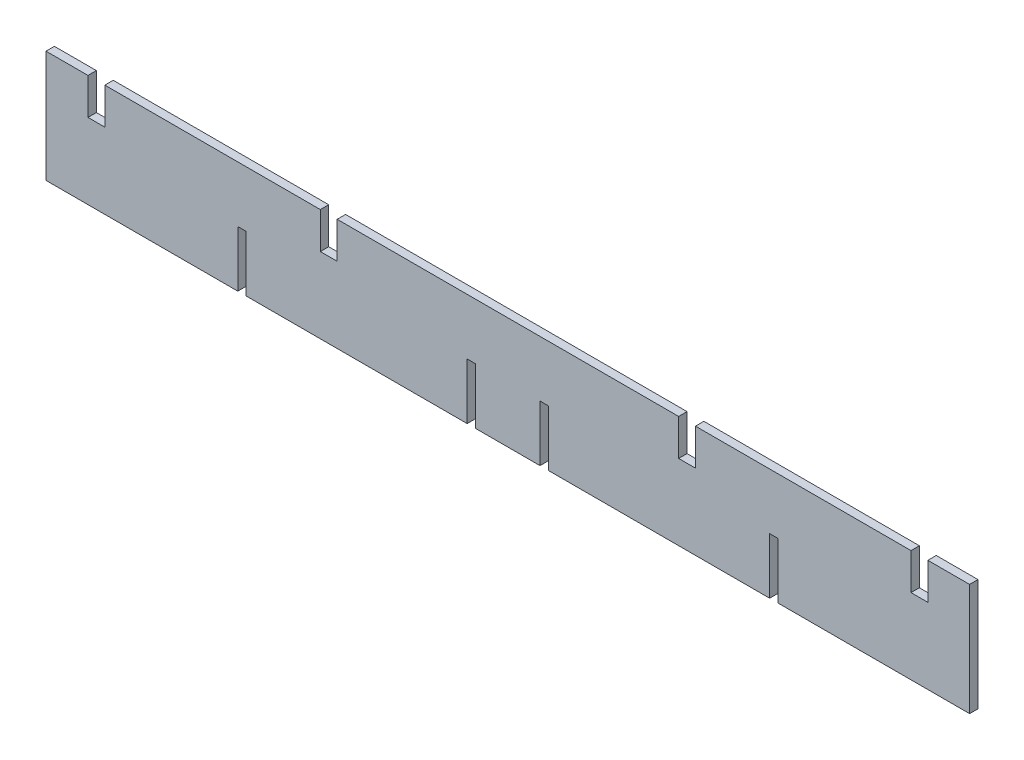
ISO-10303-21;
HEADER;
FILE_DESCRIPTION(('STEP AP214'),'2;1');
FILE_NAME('part.step','',(''),(''),'','','');
FILE_SCHEMA(('AUTOMOTIVE_DESIGN { 1 0 10303 214 1 1 1 1 }'));
ENDSEC;
DATA;
#1=APPLICATION_CONTEXT('core data for automotive mechanical design processes');
#2=APPLICATION_PROTOCOL_DEFINITION('international standard','automotive_design',2000,#1);
#3=PRODUCT_CONTEXT('',#1,'mechanical');
#4=PRODUCT('Part','Part','',(#3));
#5=PRODUCT_RELATED_PRODUCT_CATEGORY('part','',(#4));
#6=PRODUCT_DEFINITION_FORMATION('','',#4);
#7=PRODUCT_DEFINITION_CONTEXT('part definition',#1,'design');
#8=PRODUCT_DEFINITION('design','',#6,#7);
#9=PRODUCT_DEFINITION_SHAPE('','',#8);
#10=(LENGTH_UNIT() NAMED_UNIT(*) SI_UNIT(.MILLI.,.METRE.));
#11=(NAMED_UNIT(*) PLANE_ANGLE_UNIT() SI_UNIT($,.RADIAN.));
#12=(NAMED_UNIT(*) SI_UNIT($,.STERADIAN.) SOLID_ANGLE_UNIT());
#13=UNCERTAINTY_MEASURE_WITH_UNIT(LENGTH_MEASURE(1.E-05),#10,'distance_accuracy_value','');
#14=(GEOMETRIC_REPRESENTATION_CONTEXT(3) GLOBAL_UNCERTAINTY_ASSIGNED_CONTEXT((#13)) GLOBAL_UNIT_ASSIGNED_CONTEXT((#10,
#11,#12)) REPRESENTATION_CONTEXT('',''));
#15=CARTESIAN_POINT('',(0.,0.,0.));
#16=DIRECTION('',(0.,0.,1.));
#17=DIRECTION('',(1.,0.,0.));
#18=AXIS2_PLACEMENT_3D('',#15,#16,#17);
#19=CARTESIAN_POINT('',(-330.,-40.,6.));
#20=DIRECTION('',(0.,1.,0.));
#21=DIRECTION('',(0.,0.,1.));
#22=AXIS2_PLACEMENT_3D('',#19,#20,#21);
#23=PLANE('',#22);
#24=DIRECTION('',(1.,0.,0.));
#25=VECTOR('',#24,1.);
#26=CARTESIAN_POINT('',(-330.,-40.,6.));
#27=LINE('',#26,#25);
#28=CARTESIAN_POINT('',(193.12,-40.,6.));
#29=VERTEX_POINT('',#28);
#30=CARTESIAN_POINT('',(330.,-40.,6.));
#31=VERTEX_POINT('',#30);
#32=EDGE_CURVE('E493',#29,#31,#27,.T.);
#33=ORIENTED_EDGE('',*,*,#32,.F.);
#34=DIRECTION('',(0.,0.,1.));
#35=VECTOR('',#34,1.);
#36=CARTESIAN_POINT('',(193.12,-40.,-0.00100000000000013));
#37=LINE('',#36,#35);
#38=CARTESIAN_POINT('',(193.12,-40.,0.));
#39=VERTEX_POINT('',#38);
#40=EDGE_CURVE('E316',#39,#29,#37,.T.);
#41=ORIENTED_EDGE('',*,*,#40,.F.);
#42=DIRECTION('',(1.,0.,0.));
#43=VECTOR('',#42,1.);
#44=CARTESIAN_POINT('',(-330.,-40.,0.));
#45=LINE('',#44,#43);
#46=CARTESIAN_POINT('',(330.,-40.,0.));
#47=VERTEX_POINT('',#46);
#48=EDGE_CURVE('E509',#39,#47,#45,.T.);
#49=ORIENTED_EDGE('',*,*,#48,.T.);
#50=DIRECTION('',(0.,0.,-1.));
#51=VECTOR('',#50,1.);
#52=CARTESIAN_POINT('',(330.,-40.,6.));
#53=LINE('',#52,#51);
#54=EDGE_CURVE('E497',#31,#47,#53,.T.);
#55=ORIENTED_EDGE('',*,*,#54,.F.);
#56=EDGE_LOOP('',(#33,#41,#49,#55));
#57=FACE_BOUND('',#56,.T.);
#58=ADVANCED_FACE('F34',(#57),#23,.F.);
#59=CARTESIAN_POINT('',(-186.96,-40.,6.));
#60=VERTEX_POINT('',#59);
#61=CARTESIAN_POINT('',(-29.04,-40.,6.));
#62=VERTEX_POINT('',#61);
#63=EDGE_CURVE('E498',#60,#62,#27,.T.);
#64=ORIENTED_EDGE('',*,*,#63,.F.);
#65=DIRECTION('',(0.,0.,1.));
#66=VECTOR('',#65,1.);
#67=CARTESIAN_POINT('',(-186.96,-40.,-0.00100000000000013));
#68=LINE('',#67,#66);
#69=CARTESIAN_POINT('',(-186.96,-40.,0.));
#70=VERTEX_POINT('',#69);
#71=EDGE_CURVE('E285',#70,#60,#68,.T.);
#72=ORIENTED_EDGE('',*,*,#71,.F.);
#73=CARTESIAN_POINT('',(-29.04,-40.,0.));
#74=VERTEX_POINT('',#73);
#75=EDGE_CURVE('E290',#70,#74,#45,.T.);
#76=ORIENTED_EDGE('',*,*,#75,.T.);
#77=DIRECTION('',(0.,0.,1.));
#78=VECTOR('',#77,1.);
#79=CARTESIAN_POINT('',(-29.04,-40.,0.));
#80=LINE('',#79,#78);
#81=EDGE_CURVE('E348',#74,#62,#80,.T.);
#82=ORIENTED_EDGE('',*,*,#81,.T.);
#83=EDGE_LOOP('',(#64,#72,#76,#82));
#84=FACE_BOUND('',#83,.T.);
#85=ADVANCED_FACE('F603',(#84),#23,.F.);
#86=CARTESIAN_POINT('',(-23.,-40.,6.));
#87=VERTEX_POINT('',#86);
#88=CARTESIAN_POINT('',(23.,-40.,6.));
#89=VERTEX_POINT('',#88);
#90=EDGE_CURVE('E499',#87,#89,#27,.T.);
#91=ORIENTED_EDGE('',*,*,#90,.F.);
#92=DIRECTION('',(0.,0.,1.));
#93=VECTOR('',#92,1.);
#94=CARTESIAN_POINT('',(-23.,-40.,0.));
#95=LINE('',#94,#93);
#96=CARTESIAN_POINT('',(-23.,-40.,0.));
#97=VERTEX_POINT('',#96);
#98=EDGE_CURVE('E345',#97,#87,#95,.T.);
#99=ORIENTED_EDGE('',*,*,#98,.F.);
#100=CARTESIAN_POINT('',(23.,-40.,0.));
#101=VERTEX_POINT('',#100);
#102=EDGE_CURVE('E512',#97,#101,#45,.T.);
#103=ORIENTED_EDGE('',*,*,#102,.T.);
#104=DIRECTION('',(0.,0.,1.));
#105=VECTOR('',#104,1.);
#106=CARTESIAN_POINT('',(23.,-40.,0.));
#107=LINE('',#106,#105);
#108=EDGE_CURVE('E372',#101,#89,#107,.T.);
#109=ORIENTED_EDGE('',*,*,#108,.T.);
#110=EDGE_LOOP('',(#91,#99,#103,#109));
#111=FACE_BOUND('',#110,.T.);
#112=ADVANCED_FACE('F610',(#111),#23,.F.);
#113=CARTESIAN_POINT('',(29.04,-40.,0.));
#114=VERTEX_POINT('',#113);
#115=CARTESIAN_POINT('',(187.12,-40.,0.));
#116=VERTEX_POINT('',#115);
#117=EDGE_CURVE('E629',#114,#116,#45,.T.);
#118=ORIENTED_EDGE('',*,*,#117,.T.);
#119=DIRECTION('',(0.,0.,1.));
#120=VECTOR('',#119,1.);
#121=CARTESIAN_POINT('',(187.12,-40.,-0.00100000000000013));
#122=LINE('',#121,#120);
#123=CARTESIAN_POINT('',(187.12,-40.,6.));
#124=VERTEX_POINT('',#123);
#125=EDGE_CURVE('E318',#116,#124,#122,.T.);
#126=ORIENTED_EDGE('',*,*,#125,.T.);
#127=CARTESIAN_POINT('',(29.04,-40.,6.));
#128=VERTEX_POINT('',#127);
#129=EDGE_CURVE('E646',#128,#124,#27,.T.);
#130=ORIENTED_EDGE('',*,*,#129,.F.);
#131=DIRECTION('',(0.,0.,1.));
#132=VECTOR('',#131,1.);
#133=CARTESIAN_POINT('',(29.04,-40.,0.));
#134=LINE('',#133,#132);
#135=EDGE_CURVE('E340',#114,#128,#134,.T.);
#136=ORIENTED_EDGE('',*,*,#135,.F.);
#137=EDGE_LOOP('',(#118,#126,#130,#136));
#138=FACE_BOUND('',#137,.T.);
#139=ADVANCED_FACE('F599',(#138),#23,.F.);
#140=CARTESIAN_POINT('',(-330.,40.,6.));
#141=DIRECTION('',(0.,-1.,0.));
#142=DIRECTION('',(0.,0.,-1.));
#143=AXIS2_PLACEMENT_3D('',#140,#141,#142);
#144=PLANE('',#143);
#145=DIRECTION('',(-1.,0.,0.));
#146=VECTOR('',#145,1.);
#147=CARTESIAN_POINT('',(-330.,40.,0.));
#148=LINE('',#147,#146);
#149=CARTESIAN_POINT('',(-133.96,40.,0.));
#150=VERTEX_POINT('',#149);
#151=CARTESIAN_POINT('',(-287.96,40.,0.));
#152=VERTEX_POINT('',#151);
#153=EDGE_CURVE('E584',#150,#152,#148,.T.);
#154=ORIENTED_EDGE('',*,*,#153,.T.);
#155=DIRECTION('',(0.,0.,1.));
#156=VECTOR('',#155,1.);
#157=CARTESIAN_POINT('',(-287.96,40.,0.));
#158=LINE('',#157,#156);
#159=CARTESIAN_POINT('',(-287.96,40.,6.));
#160=VERTEX_POINT('',#159);
#161=EDGE_CURVE('E397',#152,#160,#158,.T.);
#162=ORIENTED_EDGE('',*,*,#161,.T.);
#163=DIRECTION('',(-1.,0.,0.));
#164=VECTOR('',#163,1.);
#165=CARTESIAN_POINT('',(-330.,40.,6.));
#166=LINE('',#165,#164);
#167=CARTESIAN_POINT('',(-133.96,40.,6.));
#168=VERTEX_POINT('',#167);
#169=EDGE_CURVE('E537',#168,#160,#166,.T.);
#170=ORIENTED_EDGE('',*,*,#169,.F.);
#171=DIRECTION('',(0.,0.,1.));
#172=VECTOR('',#171,1.);
#173=CARTESIAN_POINT('',(-133.96,40.,0.));
#174=LINE('',#173,#172);
#175=EDGE_CURVE('E393',#150,#168,#174,.T.);
#176=ORIENTED_EDGE('',*,*,#175,.F.);
#177=EDGE_LOOP('',(#154,#162,#170,#176));
#178=FACE_BOUND('',#177,.T.);
#179=ADVANCED_FACE('F583',(#178),#144,.F.);
#180=CARTESIAN_POINT('',(-300.,40.,6.));
#181=VERTEX_POINT('',#180);
#182=CARTESIAN_POINT('',(-330.,40.,6.));
#183=VERTEX_POINT('',#182);
#184=EDGE_CURVE('E485',#181,#183,#166,.T.);
#185=ORIENTED_EDGE('',*,*,#184,.F.);
#186=DIRECTION('',(0.,0.,1.));
#187=VECTOR('',#186,1.);
#188=CARTESIAN_POINT('',(-300.,40.,0.));
#189=LINE('',#188,#187);
#190=CARTESIAN_POINT('',(-300.,40.,0.));
#191=VERTEX_POINT('',#190);
#192=EDGE_CURVE('E388',#191,#181,#189,.T.);
#193=ORIENTED_EDGE('',*,*,#192,.F.);
#194=CARTESIAN_POINT('',(-330.,40.,0.));
#195=VERTEX_POINT('',#194);
#196=EDGE_CURVE('E502',#191,#195,#148,.T.);
#197=ORIENTED_EDGE('',*,*,#196,.T.);
#198=DIRECTION('',(0.,0.,-1.));
#199=VECTOR('',#198,1.);
#200=CARTESIAN_POINT('',(-330.,40.,6.));
#201=LINE('',#200,#199);
#202=EDGE_CURVE('E42',#183,#195,#201,.T.);
#203=ORIENTED_EDGE('',*,*,#202,.F.);
#204=EDGE_LOOP('',(#185,#193,#197,#203));
#205=FACE_BOUND('',#204,.T.);
#206=ADVANCED_FACE('F593',(#205),#144,.F.);
#207=CARTESIAN_POINT('',(122.08,40.,0.));
#208=VERTEX_POINT('',#207);
#209=CARTESIAN_POINT('',(-121.92,40.,0.));
#210=VERTEX_POINT('',#209);
#211=EDGE_CURVE('E570',#208,#210,#148,.T.);
#212=ORIENTED_EDGE('',*,*,#211,.T.);
#213=DIRECTION('',(0.,0.,1.));
#214=VECTOR('',#213,1.);
#215=CARTESIAN_POINT('',(-121.92,40.,0.));
#216=LINE('',#215,#214);
#217=CARTESIAN_POINT('',(-121.92,40.,6.));
#218=VERTEX_POINT('',#217);
#219=EDGE_CURVE('E426',#210,#218,#216,.T.);
#220=ORIENTED_EDGE('',*,*,#219,.T.);
#221=CARTESIAN_POINT('',(122.08,40.,6.));
#222=VERTEX_POINT('',#221);
#223=EDGE_CURVE('E539',#222,#218,#166,.T.);
#224=ORIENTED_EDGE('',*,*,#223,.F.);
#225=DIRECTION('',(0.,0.,1.));
#226=VECTOR('',#225,1.);
#227=CARTESIAN_POINT('',(122.08,40.,0.));
#228=LINE('',#227,#226);
#229=EDGE_CURVE('E421',#208,#222,#228,.T.);
#230=ORIENTED_EDGE('',*,*,#229,.F.);
#231=EDGE_LOOP('',(#212,#220,#224,#230));
#232=FACE_BOUND('',#231,.T.);
#233=ADVANCED_FACE('F569',(#232),#144,.F.);
#234=CARTESIAN_POINT('',(288.12,40.,0.));
#235=VERTEX_POINT('',#234);
#236=CARTESIAN_POINT('',(134.12,40.,0.));
#237=VERTEX_POINT('',#236);
#238=EDGE_CURVE('E507',#235,#237,#148,.T.);
#239=ORIENTED_EDGE('',*,*,#238,.T.);
#240=DIRECTION('',(0.,0.,1.));
#241=VECTOR('',#240,1.);
#242=CARTESIAN_POINT('',(134.12,40.,0.));
#243=LINE('',#242,#241);
#244=CARTESIAN_POINT('',(134.12,40.,6.));
#245=VERTEX_POINT('',#244);
#246=EDGE_CURVE('E452',#237,#245,#243,.T.);
#247=ORIENTED_EDGE('',*,*,#246,.T.);
#248=CARTESIAN_POINT('',(288.12,40.,6.));
#249=VERTEX_POINT('',#248);
#250=EDGE_CURVE('E491',#249,#245,#166,.T.);
#251=ORIENTED_EDGE('',*,*,#250,.F.);
#252=DIRECTION('',(0.,0.,1.));
#253=VECTOR('',#252,1.);
#254=CARTESIAN_POINT('',(288.12,40.,0.));
#255=LINE('',#254,#253);
#256=EDGE_CURVE('E447',#235,#249,#255,.T.);
#257=ORIENTED_EDGE('',*,*,#256,.F.);
#258=EDGE_LOOP('',(#239,#247,#251,#257));
#259=FACE_BOUND('',#258,.T.);
#260=ADVANCED_FACE('F556',(#259),#144,.F.);
#261=CARTESIAN_POINT('',(330.,40.,6.));
#262=DIRECTION('',(-1.,0.,0.));
#263=DIRECTION('',(0.,0.,1.));
#264=AXIS2_PLACEMENT_3D('',#261,#262,#263);
#265=PLANE('',#264);
#266=DIRECTION('',(0.,1.,0.));
#267=VECTOR('',#266,1.);
#268=CARTESIAN_POINT('',(330.,40.,0.));
#269=LINE('',#268,#267);
#270=CARTESIAN_POINT('',(330.,40.,0.));
#271=VERTEX_POINT('',#270);
#272=EDGE_CURVE('E400',#47,#271,#269,.T.);
#273=ORIENTED_EDGE('',*,*,#272,.T.);
#274=DIRECTION('',(0.,0.,-1.));
#275=VECTOR('',#274,1.);
#276=CARTESIAN_POINT('',(330.,40.,6.));
#277=LINE('',#276,#275);
#278=CARTESIAN_POINT('',(330.,40.,6.));
#279=VERTEX_POINT('',#278);
#280=EDGE_CURVE('E11',#279,#271,#277,.T.);
#281=ORIENTED_EDGE('',*,*,#280,.F.);
#282=DIRECTION('',(0.,1.,0.));
#283=VECTOR('',#282,1.);
#284=CARTESIAN_POINT('',(330.,40.,6.));
#285=LINE('',#284,#283);
#286=EDGE_CURVE('E482',#31,#279,#285,.T.);
#287=ORIENTED_EDGE('',*,*,#286,.F.);
#288=ORIENTED_EDGE('',*,*,#54,.T.);
#289=EDGE_LOOP('',(#273,#281,#287,#288));
#290=FACE_BOUND('',#289,.T.);
#291=ADVANCED_FACE('F36',(#290),#265,.F.);
#292=CARTESIAN_POINT('',(300.16,40.,0.));
#293=VERTEX_POINT('',#292);
#294=EDGE_CURVE('E503',#271,#293,#148,.T.);
#295=ORIENTED_EDGE('',*,*,#294,.T.);
#296=DIRECTION('',(0.,0.,1.));
#297=VECTOR('',#296,1.);
#298=CARTESIAN_POINT('',(300.16,40.,0.));
#299=LINE('',#298,#297);
#300=CARTESIAN_POINT('',(300.16,40.,6.));
#301=VERTEX_POINT('',#300);
#302=EDGE_CURVE('E476',#293,#301,#299,.T.);
#303=ORIENTED_EDGE('',*,*,#302,.T.);
#304=EDGE_CURVE('E487',#279,#301,#166,.T.);
#305=ORIENTED_EDGE('',*,*,#304,.F.);
#306=ORIENTED_EDGE('',*,*,#280,.T.);
#307=EDGE_LOOP('',(#295,#303,#305,#306));
#308=FACE_BOUND('',#307,.T.);
#309=ADVANCED_FACE('F600',(#308),#144,.F.);
#310=CARTESIAN_POINT('',(-330.,40.,6.));
#311=DIRECTION('',(1.,0.,0.));
#312=DIRECTION('',(0.,0.,-1.));
#313=AXIS2_PLACEMENT_3D('',#310,#311,#312);
#314=PLANE('',#313);
#315=DIRECTION('',(0.,-1.,0.));
#316=VECTOR('',#315,1.);
#317=CARTESIAN_POINT('',(-330.,40.,0.));
#318=LINE('',#317,#316);
#319=CARTESIAN_POINT('',(-330.,-40.,0.));
#320=VERTEX_POINT('',#319);
#321=EDGE_CURVE('E506',#195,#320,#318,.T.);
#322=ORIENTED_EDGE('',*,*,#321,.T.);
#323=DIRECTION('',(0.,0.,-1.));
#324=VECTOR('',#323,1.);
#325=CARTESIAN_POINT('',(-330.,-40.,6.));
#326=LINE('',#325,#324);
#327=CARTESIAN_POINT('',(-330.,-40.,6.));
#328=VERTEX_POINT('',#327);
#329=EDGE_CURVE('E515',#328,#320,#326,.T.);
#330=ORIENTED_EDGE('',*,*,#329,.F.);
#331=DIRECTION('',(0.,-1.,0.));
#332=VECTOR('',#331,1.);
#333=CARTESIAN_POINT('',(-330.,40.,6.));
#334=LINE('',#333,#332);
#335=EDGE_CURVE('E490',#183,#328,#334,.T.);
#336=ORIENTED_EDGE('',*,*,#335,.F.);
#337=ORIENTED_EDGE('',*,*,#202,.T.);
#338=EDGE_LOOP('',(#322,#330,#336,#337));
#339=FACE_BOUND('',#338,.T.);
#340=ADVANCED_FACE('F522',(#339),#314,.F.);
#341=CARTESIAN_POINT('',(-192.96,-40.,0.));
#342=VERTEX_POINT('',#341);
#343=EDGE_CURVE('E486',#320,#342,#45,.T.);
#344=ORIENTED_EDGE('',*,*,#343,.T.);
#345=DIRECTION('',(0.,0.,1.));
#346=VECTOR('',#345,1.);
#347=CARTESIAN_POINT('',(-192.96,-40.,-0.00100000000000013));
#348=LINE('',#347,#346);
#349=CARTESIAN_POINT('',(-192.96,-40.,6.));
#350=VERTEX_POINT('',#349);
#351=EDGE_CURVE('E300',#342,#350,#348,.T.);
#352=ORIENTED_EDGE('',*,*,#351,.T.);
#353=EDGE_CURVE('E494',#328,#350,#27,.T.);
#354=ORIENTED_EDGE('',*,*,#353,.F.);
#355=ORIENTED_EDGE('',*,*,#329,.T.);
#356=EDGE_LOOP('',(#344,#352,#354,#355));
#357=FACE_BOUND('',#356,.T.);
#358=ADVANCED_FACE('F529',(#357),#23,.F.);
#359=CARTESIAN_POINT('',(0.,0.,6.));
#360=DIRECTION('',(0.,0.,1.));
#361=DIRECTION('',(1.,0.,0.));
#362=AXIS2_PLACEMENT_3D('',#359,#360,#361);
#363=PLANE('',#362);
#364=DIRECTION('',(0.,1.,0.));
#365=VECTOR('',#364,1.);
#366=CARTESIAN_POINT('',(-186.96,-40.,6.));
#367=LINE('',#366,#365);
#368=CARTESIAN_POINT('',(-186.96,0.,6.));
#369=VERTEX_POINT('',#368);
#370=EDGE_CURVE('E273',#60,#369,#367,.T.);
#371=ORIENTED_EDGE('',*,*,#370,.F.);
#372=ORIENTED_EDGE('',*,*,#63,.T.);
#373=DIRECTION('',(0.,-1.,0.));
#374=VECTOR('',#373,1.);
#375=CARTESIAN_POINT('',(-29.04,0.,6.));
#376=LINE('',#375,#374);
#377=CARTESIAN_POINT('',(-29.04,0.,6.));
#378=VERTEX_POINT('',#377);
#379=EDGE_CURVE('E330',#378,#62,#376,.T.);
#380=ORIENTED_EDGE('',*,*,#379,.F.);
#381=DIRECTION('',(-1.,0.,0.));
#382=VECTOR('',#381,1.);
#383=CARTESIAN_POINT('',(-29.04,0.,6.));
#384=LINE('',#383,#382);
#385=CARTESIAN_POINT('',(-23.,0.,6.));
#386=VERTEX_POINT('',#385);
#387=EDGE_CURVE('E339',#386,#378,#384,.T.);
#388=ORIENTED_EDGE('',*,*,#387,.F.);
#389=DIRECTION('',(0.,1.,0.));
#390=VECTOR('',#389,1.);
#391=CARTESIAN_POINT('',(-23.,-40.,6.));
#392=LINE('',#391,#390);
#393=EDGE_CURVE('E336',#87,#386,#392,.T.);
#394=ORIENTED_EDGE('',*,*,#393,.F.);
#395=ORIENTED_EDGE('',*,*,#90,.T.);
#396=DIRECTION('',(0.,-1.,0.));
#397=VECTOR('',#396,1.);
#398=CARTESIAN_POINT('',(23.,0.,6.));
#399=LINE('',#398,#397);
#400=CARTESIAN_POINT('',(23.,0.,6.));
#401=VERTEX_POINT('',#400);
#402=EDGE_CURVE('E358',#401,#89,#399,.T.);
#403=ORIENTED_EDGE('',*,*,#402,.F.);
#404=DIRECTION('',(-1.,0.,0.));
#405=VECTOR('',#404,1.);
#406=CARTESIAN_POINT('',(23.,0.,6.));
#407=LINE('',#406,#405);
#408=CARTESIAN_POINT('',(29.04,0.,6.));
#409=VERTEX_POINT('',#408);
#410=EDGE_CURVE('E367',#409,#401,#407,.T.);
#411=ORIENTED_EDGE('',*,*,#410,.F.);
#412=DIRECTION('',(0.,1.,0.));
#413=VECTOR('',#412,1.);
#414=CARTESIAN_POINT('',(29.04,-40.,6.));
#415=LINE('',#414,#413);
#416=EDGE_CURVE('E284',#128,#409,#415,.T.);
#417=ORIENTED_EDGE('',*,*,#416,.F.);
#418=ORIENTED_EDGE('',*,*,#129,.T.);
#419=DIRECTION('',(0.,-1.,0.));
#420=VECTOR('',#419,1.);
#421=CARTESIAN_POINT('',(187.12,-40.,6.));
#422=LINE('',#421,#420);
#423=CARTESIAN_POINT('',(187.12,0.,6.));
#424=VERTEX_POINT('',#423);
#425=EDGE_CURVE('E313',#424,#124,#422,.T.);
#426=ORIENTED_EDGE('',*,*,#425,.F.);
#427=DIRECTION('',(-1.,0.,0.));
#428=VECTOR('',#427,1.);
#429=CARTESIAN_POINT('',(193.12,0.,6.));
#430=LINE('',#429,#428);
#431=CARTESIAN_POINT('',(193.12,0.,6.));
#432=VERTEX_POINT('',#431);
#433=EDGE_CURVE('E310',#432,#424,#430,.T.);
#434=ORIENTED_EDGE('',*,*,#433,.F.);
#435=DIRECTION('',(0.,1.,0.));
#436=VECTOR('',#435,1.);
#437=CARTESIAN_POINT('',(193.12,-40.,6.));
#438=LINE('',#437,#436);
#439=EDGE_CURVE('E307',#29,#432,#438,.T.);
#440=ORIENTED_EDGE('',*,*,#439,.F.);
#441=ORIENTED_EDGE('',*,*,#32,.T.);
#442=ORIENTED_EDGE('',*,*,#286,.T.);
#443=ORIENTED_EDGE('',*,*,#304,.T.);
#444=DIRECTION('',(0.,1.,0.));
#445=VECTOR('',#444,1.);
#446=CARTESIAN_POINT('',(300.16,40.,6.));
#447=LINE('',#446,#445);
#448=CARTESIAN_POINT('',(300.16,14.,6.));
#449=VERTEX_POINT('',#448);
#450=EDGE_CURVE('E462',#449,#301,#447,.T.);
#451=ORIENTED_EDGE('',*,*,#450,.F.);
#452=DIRECTION('',(1.,0.,0.));
#453=VECTOR('',#452,1.);
#454=CARTESIAN_POINT('',(288.12,14.,6.));
#455=LINE('',#454,#453);
#456=CARTESIAN_POINT('',(288.12,14.,6.));
#457=VERTEX_POINT('',#456);
#458=EDGE_CURVE('E471',#457,#449,#455,.T.);
#459=ORIENTED_EDGE('',*,*,#458,.F.);
#460=DIRECTION('',(0.,-1.,0.));
#461=VECTOR('',#460,1.);
#462=CARTESIAN_POINT('',(288.12,40.,6.));
#463=LINE('',#462,#461);
#464=EDGE_CURVE('E347',#249,#457,#463,.T.);
#465=ORIENTED_EDGE('',*,*,#464,.F.);
#466=ORIENTED_EDGE('',*,*,#250,.T.);
#467=DIRECTION('',(0.,1.,0.));
#468=VECTOR('',#467,1.);
#469=CARTESIAN_POINT('',(134.12,40.,6.));
#470=LINE('',#469,#468);
#471=CARTESIAN_POINT('',(134.12,14.,6.));
#472=VERTEX_POINT('',#471);
#473=EDGE_CURVE('E436',#472,#245,#470,.T.);
#474=ORIENTED_EDGE('',*,*,#473,.F.);
#475=DIRECTION('',(1.,0.,0.));
#476=VECTOR('',#475,1.);
#477=CARTESIAN_POINT('',(122.08,14.,6.));
#478=LINE('',#477,#476);
#479=CARTESIAN_POINT('',(122.08,14.,6.));
#480=VERTEX_POINT('',#479);
#481=EDGE_CURVE('E446',#480,#472,#478,.T.);
#482=ORIENTED_EDGE('',*,*,#481,.F.);
#483=DIRECTION('',(0.,-1.,0.));
#484=VECTOR('',#483,1.);
#485=CARTESIAN_POINT('',(122.08,40.,6.));
#486=LINE('',#485,#484);
#487=EDGE_CURVE('E443',#222,#480,#486,.T.);
#488=ORIENTED_EDGE('',*,*,#487,.F.);
#489=ORIENTED_EDGE('',*,*,#223,.T.);
#490=DIRECTION('',(0.,1.,0.));
#491=VECTOR('',#490,1.);
#492=CARTESIAN_POINT('',(-121.92,40.,6.));
#493=LINE('',#492,#491);
#494=CARTESIAN_POINT('',(-121.92,14.,6.));
#495=VERTEX_POINT('',#494);
#496=EDGE_CURVE('E410',#495,#218,#493,.T.);
#497=ORIENTED_EDGE('',*,*,#496,.F.);
#498=DIRECTION('',(1.,0.,0.));
#499=VECTOR('',#498,1.);
#500=CARTESIAN_POINT('',(-133.96,14.,6.));
#501=LINE('',#500,#499);
#502=CARTESIAN_POINT('',(-133.96,14.,6.));
#503=VERTEX_POINT('',#502);
#504=EDGE_CURVE('E420',#503,#495,#501,.T.);
#505=ORIENTED_EDGE('',*,*,#504,.F.);
#506=DIRECTION('',(0.,-1.,0.));
#507=VECTOR('',#506,1.);
#508=CARTESIAN_POINT('',(-133.96,40.,6.));
#509=LINE('',#508,#507);
#510=EDGE_CURVE('E417',#168,#503,#509,.T.);
#511=ORIENTED_EDGE('',*,*,#510,.F.);
#512=ORIENTED_EDGE('',*,*,#169,.T.);
#513=DIRECTION('',(0.,1.,0.));
#514=VECTOR('',#513,1.);
#515=CARTESIAN_POINT('',(-287.96,14.,6.));
#516=LINE('',#515,#514);
#517=CARTESIAN_POINT('',(-287.96,14.,6.));
#518=VERTEX_POINT('',#517);
#519=EDGE_CURVE('E382',#518,#160,#516,.T.);
#520=ORIENTED_EDGE('',*,*,#519,.F.);
#521=DIRECTION('',(1.,0.,0.));
#522=VECTOR('',#521,1.);
#523=CARTESIAN_POINT('',(-300.,14.,6.));
#524=LINE('',#523,#522);
#525=CARTESIAN_POINT('',(-300.,14.,6.));
#526=VERTEX_POINT('',#525);
#527=EDGE_CURVE('E392',#526,#518,#524,.T.);
#528=ORIENTED_EDGE('',*,*,#527,.F.);
#529=DIRECTION('',(0.,-1.,0.));
#530=VECTOR('',#529,1.);
#531=CARTESIAN_POINT('',(-300.,40.,6.));
#532=LINE('',#531,#530);
#533=EDGE_CURVE('E389',#181,#526,#532,.T.);
#534=ORIENTED_EDGE('',*,*,#533,.F.);
#535=ORIENTED_EDGE('',*,*,#184,.T.);
#536=ORIENTED_EDGE('',*,*,#335,.T.);
#537=ORIENTED_EDGE('',*,*,#353,.T.);
#538=DIRECTION('',(0.,-1.,0.));
#539=VECTOR('',#538,1.);
#540=CARTESIAN_POINT('',(-192.96,-40.,6.));
#541=LINE('',#540,#539);
#542=CARTESIAN_POINT('',(-192.96,0.,6.));
#543=VERTEX_POINT('',#542);
#544=EDGE_CURVE('E278',#543,#350,#541,.T.);
#545=ORIENTED_EDGE('',*,*,#544,.F.);
#546=DIRECTION('',(-1.,0.,0.));
#547=VECTOR('',#546,1.);
#548=CARTESIAN_POINT('',(-186.96,0.,6.));
#549=LINE('',#548,#547);
#550=EDGE_CURVE('E292',#369,#543,#549,.T.);
#551=ORIENTED_EDGE('',*,*,#550,.F.);
#552=EDGE_LOOP('',(#371,#372,#380,#388,#394,#395,#403,#411,#417,#418,#426,#434,#440,#441,#442,
#443,#451,#459,#465,#466,#474,#482,#488,#489,#497,#505,#511,#512,#520,#528,#534,#535,#536,#537,
#545,#551));
#553=FACE_BOUND('',#552,.T.);
#554=ADVANCED_FACE('F533',(#553),#363,.T.);
#555=CARTESIAN_POINT('',(0.,0.,0.));
#556=DIRECTION('',(0.,0.,1.));
#557=DIRECTION('',(1.,0.,0.));
#558=AXIS2_PLACEMENT_3D('',#555,#556,#557);
#559=PLANE('',#558);
#560=ORIENTED_EDGE('',*,*,#75,.F.);
#561=DIRECTION('',(0.,-1.,0.));
#562=VECTOR('',#561,1.);
#563=CARTESIAN_POINT('',(-186.96,-40.,0.));
#564=LINE('',#563,#562);
#565=CARTESIAN_POINT('',(-186.96,0.,0.));
#566=VERTEX_POINT('',#565);
#567=EDGE_CURVE('E270',#566,#70,#564,.T.);
#568=ORIENTED_EDGE('',*,*,#567,.F.);
#569=DIRECTION('',(1.,0.,0.));
#570=VECTOR('',#569,1.);
#571=CARTESIAN_POINT('',(-186.96,0.,0.));
#572=LINE('',#571,#570);
#573=CARTESIAN_POINT('',(-192.96,0.,0.));
#574=VERTEX_POINT('',#573);
#575=EDGE_CURVE('E281',#574,#566,#572,.T.);
#576=ORIENTED_EDGE('',*,*,#575,.F.);
#577=DIRECTION('',(0.,1.,0.));
#578=VECTOR('',#577,1.);
#579=CARTESIAN_POINT('',(-192.96,-40.,0.));
#580=LINE('',#579,#578);
#581=EDGE_CURVE('E49',#342,#574,#580,.T.);
#582=ORIENTED_EDGE('',*,*,#581,.F.);
#583=ORIENTED_EDGE('',*,*,#343,.F.);
#584=ORIENTED_EDGE('',*,*,#321,.F.);
#585=ORIENTED_EDGE('',*,*,#196,.F.);
#586=DIRECTION('',(0.,-1.,0.));
#587=VECTOR('',#586,1.);
#588=CARTESIAN_POINT('',(-300.,40.,0.));
#589=LINE('',#588,#587);
#590=CARTESIAN_POINT('',(-300.,14.,0.));
#591=VERTEX_POINT('',#590);
#592=EDGE_CURVE('E378',#191,#591,#589,.T.);
#593=ORIENTED_EDGE('',*,*,#592,.T.);
#594=DIRECTION('',(1.,0.,0.));
#595=VECTOR('',#594,1.);
#596=CARTESIAN_POINT('',(-300.,14.,0.));
#597=LINE('',#596,#595);
#598=CARTESIAN_POINT('',(-287.96,14.,0.));
#599=VERTEX_POINT('',#598);
#600=EDGE_CURVE('E381',#591,#599,#597,.T.);
#601=ORIENTED_EDGE('',*,*,#600,.T.);
#602=DIRECTION('',(0.,1.,0.));
#603=VECTOR('',#602,1.);
#604=CARTESIAN_POINT('',(-287.96,14.,0.));
#605=LINE('',#604,#603);
#606=EDGE_CURVE('E385',#599,#152,#605,.T.);
#607=ORIENTED_EDGE('',*,*,#606,.T.);
#608=ORIENTED_EDGE('',*,*,#153,.F.);
#609=DIRECTION('',(0.,-1.,0.));
#610=VECTOR('',#609,1.);
#611=CARTESIAN_POINT('',(-133.96,40.,0.));
#612=LINE('',#611,#610);
#613=CARTESIAN_POINT('',(-133.96,14.,0.));
#614=VERTEX_POINT('',#613);
#615=EDGE_CURVE('E406',#150,#614,#612,.T.);
#616=ORIENTED_EDGE('',*,*,#615,.T.);
#617=DIRECTION('',(1.,0.,0.));
#618=VECTOR('',#617,1.);
#619=CARTESIAN_POINT('',(-133.96,14.,0.));
#620=LINE('',#619,#618);
#621=CARTESIAN_POINT('',(-121.92,14.,0.));
#622=VERTEX_POINT('',#621);
#623=EDGE_CURVE('E409',#614,#622,#620,.T.);
#624=ORIENTED_EDGE('',*,*,#623,.T.);
#625=DIRECTION('',(0.,1.,0.));
#626=VECTOR('',#625,1.);
#627=CARTESIAN_POINT('',(-121.92,40.,0.));
#628=LINE('',#627,#626);
#629=EDGE_CURVE('E413',#622,#210,#628,.T.);
#630=ORIENTED_EDGE('',*,*,#629,.T.);
#631=ORIENTED_EDGE('',*,*,#211,.F.);
#632=DIRECTION('',(0.,-1.,0.));
#633=VECTOR('',#632,1.);
#634=CARTESIAN_POINT('',(122.08,40.,0.));
#635=LINE('',#634,#633);
#636=CARTESIAN_POINT('',(122.08,14.,0.));
#637=VERTEX_POINT('',#636);
#638=EDGE_CURVE('E432',#208,#637,#635,.T.);
#639=ORIENTED_EDGE('',*,*,#638,.T.);
#640=DIRECTION('',(1.,0.,0.));
#641=VECTOR('',#640,1.);
#642=CARTESIAN_POINT('',(122.08,14.,0.));
#643=LINE('',#642,#641);
#644=CARTESIAN_POINT('',(134.12,14.,0.));
#645=VERTEX_POINT('',#644);
#646=EDGE_CURVE('E435',#637,#645,#643,.T.);
#647=ORIENTED_EDGE('',*,*,#646,.T.);
#648=DIRECTION('',(0.,1.,0.));
#649=VECTOR('',#648,1.);
#650=CARTESIAN_POINT('',(134.12,40.,0.));
#651=LINE('',#650,#649);
#652=EDGE_CURVE('E439',#645,#237,#651,.T.);
#653=ORIENTED_EDGE('',*,*,#652,.T.);
#654=ORIENTED_EDGE('',*,*,#238,.F.);
#655=DIRECTION('',(0.,-1.,0.));
#656=VECTOR('',#655,1.);
#657=CARTESIAN_POINT('',(288.12,40.,0.));
#658=LINE('',#657,#656);
#659=CARTESIAN_POINT('',(288.12,14.,0.));
#660=VERTEX_POINT('',#659);
#661=EDGE_CURVE('E458',#235,#660,#658,.T.);
#662=ORIENTED_EDGE('',*,*,#661,.T.);
#663=DIRECTION('',(1.,0.,0.));
#664=VECTOR('',#663,1.);
#665=CARTESIAN_POINT('',(288.12,14.,0.));
#666=LINE('',#665,#664);
#667=CARTESIAN_POINT('',(300.16,14.,0.));
#668=VERTEX_POINT('',#667);
#669=EDGE_CURVE('E461',#660,#668,#666,.T.);
#670=ORIENTED_EDGE('',*,*,#669,.T.);
#671=DIRECTION('',(0.,1.,0.));
#672=VECTOR('',#671,1.);
#673=CARTESIAN_POINT('',(300.16,40.,0.));
#674=LINE('',#673,#672);
#675=EDGE_CURVE('E465',#668,#293,#674,.T.);
#676=ORIENTED_EDGE('',*,*,#675,.T.);
#677=ORIENTED_EDGE('',*,*,#294,.F.);
#678=ORIENTED_EDGE('',*,*,#272,.F.);
#679=ORIENTED_EDGE('',*,*,#48,.F.);
#680=DIRECTION('',(0.,-1.,0.));
#681=VECTOR('',#680,1.);
#682=CARTESIAN_POINT('',(193.12,-40.,0.));
#683=LINE('',#682,#681);
#684=CARTESIAN_POINT('',(193.12,0.,0.));
#685=VERTEX_POINT('',#684);
#686=EDGE_CURVE('E305',#685,#39,#683,.T.);
#687=ORIENTED_EDGE('',*,*,#686,.F.);
#688=DIRECTION('',(1.,0.,0.));
#689=VECTOR('',#688,1.);
#690=CARTESIAN_POINT('',(193.12,0.,0.));
#691=LINE('',#690,#689);
#692=CARTESIAN_POINT('',(187.12,0.,0.));
#693=VERTEX_POINT('',#692);
#694=EDGE_CURVE('E294',#693,#685,#691,.T.);
#695=ORIENTED_EDGE('',*,*,#694,.F.);
#696=DIRECTION('',(0.,1.,0.));
#697=VECTOR('',#696,1.);
#698=CARTESIAN_POINT('',(187.12,-40.,0.));
#699=LINE('',#698,#697);
#700=EDGE_CURVE('E57',#116,#693,#699,.T.);
#701=ORIENTED_EDGE('',*,*,#700,.F.);
#702=ORIENTED_EDGE('',*,*,#117,.F.);
#703=DIRECTION('',(0.,1.,0.));
#704=VECTOR('',#703,1.);
#705=CARTESIAN_POINT('',(29.04,-40.,0.));
#706=LINE('',#705,#704);
#707=CARTESIAN_POINT('',(29.04,0.,0.));
#708=VERTEX_POINT('',#707);
#709=EDGE_CURVE('E354',#114,#708,#706,.T.);
#710=ORIENTED_EDGE('',*,*,#709,.T.);
#711=DIRECTION('',(-1.,0.,0.));
#712=VECTOR('',#711,1.);
#713=CARTESIAN_POINT('',(23.,0.,0.));
#714=LINE('',#713,#712);
#715=CARTESIAN_POINT('',(23.,0.,0.));
#716=VERTEX_POINT('',#715);
#717=EDGE_CURVE('E357',#708,#716,#714,.T.);
#718=ORIENTED_EDGE('',*,*,#717,.T.);
#719=DIRECTION('',(0.,-1.,0.));
#720=VECTOR('',#719,1.);
#721=CARTESIAN_POINT('',(23.,0.,0.));
#722=LINE('',#721,#720);
#723=EDGE_CURVE('E361',#716,#101,#722,.T.);
#724=ORIENTED_EDGE('',*,*,#723,.T.);
#725=ORIENTED_EDGE('',*,*,#102,.F.);
#726=DIRECTION('',(0.,1.,0.));
#727=VECTOR('',#726,1.);
#728=CARTESIAN_POINT('',(-23.,-40.,0.));
#729=LINE('',#728,#727);
#730=CARTESIAN_POINT('',(-23.,0.,0.));
#731=VERTEX_POINT('',#730);
#732=EDGE_CURVE('E326',#97,#731,#729,.T.);
#733=ORIENTED_EDGE('',*,*,#732,.T.);
#734=DIRECTION('',(-1.,0.,0.));
#735=VECTOR('',#734,1.);
#736=CARTESIAN_POINT('',(-29.04,0.,0.));
#737=LINE('',#736,#735);
#738=CARTESIAN_POINT('',(-29.04,0.,0.));
#739=VERTEX_POINT('',#738);
#740=EDGE_CURVE('E329',#731,#739,#737,.T.);
#741=ORIENTED_EDGE('',*,*,#740,.T.);
#742=DIRECTION('',(0.,-1.,0.));
#743=VECTOR('',#742,1.);
#744=CARTESIAN_POINT('',(-29.04,0.,0.));
#745=LINE('',#744,#743);
#746=EDGE_CURVE('E333',#739,#74,#745,.T.);
#747=ORIENTED_EDGE('',*,*,#746,.T.);
#748=EDGE_LOOP('',(#560,#568,#576,#582,#583,#584,#585,#593,#601,#607,#608,#616,#624,#630,#631,
#639,#647,#653,#654,#662,#670,#676,#677,#678,#679,#687,#695,#701,#702,#710,#718,#724,#725,#733,
#741,#747));
#749=FACE_BOUND('',#748,.T.);
#750=ADVANCED_FACE('F288',(#749),#559,.F.);
#751=CARTESIAN_POINT('',(288.12,40.,0.));
#752=DIRECTION('',(-1.,0.,0.));
#753=DIRECTION('',(0.,0.,1.));
#754=AXIS2_PLACEMENT_3D('',#751,#752,#753);
#755=PLANE('',#754);
#756=ORIENTED_EDGE('',*,*,#464,.T.);
#757=DIRECTION('',(0.,0.,1.));
#758=VECTOR('',#757,1.);
#759=CARTESIAN_POINT('',(288.12,14.,0.));
#760=LINE('',#759,#758);
#761=EDGE_CURVE('E468',#660,#457,#760,.T.);
#762=ORIENTED_EDGE('',*,*,#761,.F.);
#763=ORIENTED_EDGE('',*,*,#661,.F.);
#764=ORIENTED_EDGE('',*,*,#256,.T.);
#765=EDGE_LOOP('',(#756,#762,#763,#764));
#766=FACE_BOUND('',#765,.T.);
#767=ADVANCED_FACE('F704',(#766),#755,.F.);
#768=CARTESIAN_POINT('',(300.16,40.,0.));
#769=DIRECTION('',(1.,0.,0.));
#770=DIRECTION('',(0.,0.,-1.));
#771=AXIS2_PLACEMENT_3D('',#768,#769,#770);
#772=PLANE('',#771);
#773=ORIENTED_EDGE('',*,*,#450,.T.);
#774=ORIENTED_EDGE('',*,*,#302,.F.);
#775=ORIENTED_EDGE('',*,*,#675,.F.);
#776=DIRECTION('',(0.,0.,1.));
#777=VECTOR('',#776,1.);
#778=CARTESIAN_POINT('',(300.16,14.,0.));
#779=LINE('',#778,#777);
#780=EDGE_CURVE('E479',#668,#449,#779,.T.);
#781=ORIENTED_EDGE('',*,*,#780,.T.);
#782=EDGE_LOOP('',(#773,#774,#775,#781));
#783=FACE_BOUND('',#782,.T.);
#784=ADVANCED_FACE('F701',(#783),#772,.F.);
#785=CARTESIAN_POINT('',(288.12,14.,0.));
#786=DIRECTION('',(0.,-1.,0.));
#787=DIRECTION('',(0.,0.,-1.));
#788=AXIS2_PLACEMENT_3D('',#785,#786,#787);
#789=PLANE('',#788);
#790=ORIENTED_EDGE('',*,*,#458,.T.);
#791=ORIENTED_EDGE('',*,*,#780,.F.);
#792=ORIENTED_EDGE('',*,*,#669,.F.);
#793=ORIENTED_EDGE('',*,*,#761,.T.);
#794=EDGE_LOOP('',(#790,#791,#792,#793));
#795=FACE_BOUND('',#794,.T.);
#796=ADVANCED_FACE('F700',(#795),#789,.F.);
#797=CARTESIAN_POINT('',(122.08,40.,0.));
#798=DIRECTION('',(-1.,0.,0.));
#799=DIRECTION('',(0.,0.,1.));
#800=AXIS2_PLACEMENT_3D('',#797,#798,#799);
#801=PLANE('',#800);
#802=ORIENTED_EDGE('',*,*,#487,.T.);
#803=DIRECTION('',(0.,0.,1.));
#804=VECTOR('',#803,1.);
#805=CARTESIAN_POINT('',(122.08,14.,0.));
#806=LINE('',#805,#804);
#807=EDGE_CURVE('E442',#637,#480,#806,.T.);
#808=ORIENTED_EDGE('',*,*,#807,.F.);
#809=ORIENTED_EDGE('',*,*,#638,.F.);
#810=ORIENTED_EDGE('',*,*,#229,.T.);
#811=EDGE_LOOP('',(#802,#808,#809,#810));
#812=FACE_BOUND('',#811,.T.);
#813=ADVANCED_FACE('F695',(#812),#801,.F.);
#814=CARTESIAN_POINT('',(134.12,40.,0.));
#815=DIRECTION('',(1.,0.,0.));
#816=DIRECTION('',(0.,0.,-1.));
#817=AXIS2_PLACEMENT_3D('',#814,#815,#816);
#818=PLANE('',#817);
#819=ORIENTED_EDGE('',*,*,#473,.T.);
#820=ORIENTED_EDGE('',*,*,#246,.F.);
#821=ORIENTED_EDGE('',*,*,#652,.F.);
#822=DIRECTION('',(0.,0.,1.));
#823=VECTOR('',#822,1.);
#824=CARTESIAN_POINT('',(134.12,14.,0.));
#825=LINE('',#824,#823);
#826=EDGE_CURVE('E455',#645,#472,#825,.T.);
#827=ORIENTED_EDGE('',*,*,#826,.T.);
#828=EDGE_LOOP('',(#819,#820,#821,#827));
#829=FACE_BOUND('',#828,.T.);
#830=ADVANCED_FACE('F559',(#829),#818,.F.);
#831=CARTESIAN_POINT('',(122.08,14.,0.));
#832=DIRECTION('',(0.,-1.,0.));
#833=DIRECTION('',(1.,0.,0.));
#834=AXIS2_PLACEMENT_3D('',#831,#832,#833);
#835=PLANE('',#834);
#836=ORIENTED_EDGE('',*,*,#481,.T.);
#837=ORIENTED_EDGE('',*,*,#826,.F.);
#838=ORIENTED_EDGE('',*,*,#646,.F.);
#839=ORIENTED_EDGE('',*,*,#807,.T.);
#840=EDGE_LOOP('',(#836,#837,#838,#839));
#841=FACE_BOUND('',#840,.T.);
#842=ADVANCED_FACE('F564',(#841),#835,.F.);
#843=CARTESIAN_POINT('',(-133.96,40.,0.));
#844=DIRECTION('',(-1.,0.,0.));
#845=DIRECTION('',(0.,0.,1.));
#846=AXIS2_PLACEMENT_3D('',#843,#844,#845);
#847=PLANE('',#846);
#848=ORIENTED_EDGE('',*,*,#510,.T.);
#849=DIRECTION('',(0.,0.,1.));
#850=VECTOR('',#849,1.);
#851=CARTESIAN_POINT('',(-133.96,14.,0.));
#852=LINE('',#851,#850);
#853=EDGE_CURVE('E416',#614,#503,#852,.T.);
#854=ORIENTED_EDGE('',*,*,#853,.F.);
#855=ORIENTED_EDGE('',*,*,#615,.F.);
#856=ORIENTED_EDGE('',*,*,#175,.T.);
#857=EDGE_LOOP('',(#848,#854,#855,#856));
#858=FACE_BOUND('',#857,.T.);
#859=ADVANCED_FACE('F688',(#858),#847,.F.);
#860=CARTESIAN_POINT('',(-121.92,40.,0.));
#861=DIRECTION('',(1.,0.,0.));
#862=DIRECTION('',(0.,0.,-1.));
#863=AXIS2_PLACEMENT_3D('',#860,#861,#862);
#864=PLANE('',#863);
#865=ORIENTED_EDGE('',*,*,#496,.T.);
#866=ORIENTED_EDGE('',*,*,#219,.F.);
#867=ORIENTED_EDGE('',*,*,#629,.F.);
#868=DIRECTION('',(0.,0.,1.));
#869=VECTOR('',#868,1.);
#870=CARTESIAN_POINT('',(-121.92,14.,0.));
#871=LINE('',#870,#869);
#872=EDGE_CURVE('E429',#622,#495,#871,.T.);
#873=ORIENTED_EDGE('',*,*,#872,.T.);
#874=EDGE_LOOP('',(#865,#866,#867,#873));
#875=FACE_BOUND('',#874,.T.);
#876=ADVANCED_FACE('F572',(#875),#864,.F.);
#877=CARTESIAN_POINT('',(-133.96,14.,0.));
#878=DIRECTION('',(0.,-1.,0.));
#879=DIRECTION('',(0.,0.,-1.));
#880=AXIS2_PLACEMENT_3D('',#877,#878,#879);
#881=PLANE('',#880);
#882=ORIENTED_EDGE('',*,*,#504,.T.);
#883=ORIENTED_EDGE('',*,*,#872,.F.);
#884=ORIENTED_EDGE('',*,*,#623,.F.);
#885=ORIENTED_EDGE('',*,*,#853,.T.);
#886=EDGE_LOOP('',(#882,#883,#884,#885));
#887=FACE_BOUND('',#886,.T.);
#888=ADVANCED_FACE('F577',(#887),#881,.F.);
#889=CARTESIAN_POINT('',(-287.96,14.,0.));
#890=DIRECTION('',(1.,0.,0.));
#891=DIRECTION('',(0.,0.,-1.));
#892=AXIS2_PLACEMENT_3D('',#889,#890,#891);
#893=PLANE('',#892);
#894=ORIENTED_EDGE('',*,*,#519,.T.);
#895=ORIENTED_EDGE('',*,*,#161,.F.);
#896=ORIENTED_EDGE('',*,*,#606,.F.);
#897=DIRECTION('',(0.,0.,1.));
#898=VECTOR('',#897,1.);
#899=CARTESIAN_POINT('',(-287.96,14.,0.));
#900=LINE('',#899,#898);
#901=EDGE_CURVE('E401',#599,#518,#900,.T.);
#902=ORIENTED_EDGE('',*,*,#901,.T.);
#903=EDGE_LOOP('',(#894,#895,#896,#902));
#904=FACE_BOUND('',#903,.T.);
#905=ADVANCED_FACE('F587',(#904),#893,.F.);
#906=CARTESIAN_POINT('',(-300.,14.,0.));
#907=DIRECTION('',(0.,-1.,0.));
#908=DIRECTION('',(0.,0.,-1.));
#909=AXIS2_PLACEMENT_3D('',#906,#907,#908);
#910=PLANE('',#909);
#911=ORIENTED_EDGE('',*,*,#527,.T.);
#912=ORIENTED_EDGE('',*,*,#901,.F.);
#913=ORIENTED_EDGE('',*,*,#600,.F.);
#914=DIRECTION('',(0.,0.,1.));
#915=VECTOR('',#914,1.);
#916=CARTESIAN_POINT('',(-300.,14.,0.));
#917=LINE('',#916,#915);
#918=EDGE_CURVE('E403',#591,#526,#917,.T.);
#919=ORIENTED_EDGE('',*,*,#918,.T.);
#920=EDGE_LOOP('',(#911,#912,#913,#919));
#921=FACE_BOUND('',#920,.T.);
#922=ADVANCED_FACE('F590',(#921),#910,.F.);
#923=CARTESIAN_POINT('',(-300.,40.,0.));
#924=DIRECTION('',(-1.,0.,0.));
#925=DIRECTION('',(0.,-1.,0.));
#926=AXIS2_PLACEMENT_3D('',#923,#924,#925);
#927=PLANE('',#926);
#928=ORIENTED_EDGE('',*,*,#533,.T.);
#929=ORIENTED_EDGE('',*,*,#918,.F.);
#930=ORIENTED_EDGE('',*,*,#592,.F.);
#931=ORIENTED_EDGE('',*,*,#192,.T.);
#932=EDGE_LOOP('',(#928,#929,#930,#931));
#933=FACE_BOUND('',#932,.T.);
#934=ADVANCED_FACE('F592',(#933),#927,.F.);
#935=CARTESIAN_POINT('',(29.04,-40.,0.));
#936=DIRECTION('',(1.,0.,0.));
#937=DIRECTION('',(0.,0.,-1.));
#938=AXIS2_PLACEMENT_3D('',#935,#936,#937);
#939=PLANE('',#938);
#940=ORIENTED_EDGE('',*,*,#416,.T.);
#941=DIRECTION('',(0.,0.,1.));
#942=VECTOR('',#941,1.);
#943=CARTESIAN_POINT('',(29.04,0.,0.));
#944=LINE('',#943,#942);
#945=EDGE_CURVE('E364',#708,#409,#944,.T.);
#946=ORIENTED_EDGE('',*,*,#945,.F.);
#947=ORIENTED_EDGE('',*,*,#709,.F.);
#948=ORIENTED_EDGE('',*,*,#135,.T.);
#949=EDGE_LOOP('',(#940,#946,#947,#948));
#950=FACE_BOUND('',#949,.T.);
#951=ADVANCED_FACE('F655',(#950),#939,.F.);
#952=CARTESIAN_POINT('',(23.,0.,0.));
#953=DIRECTION('',(-1.,0.,0.));
#954=DIRECTION('',(0.,-1.,0.));
#955=AXIS2_PLACEMENT_3D('',#952,#953,#954);
#956=PLANE('',#955);
#957=ORIENTED_EDGE('',*,*,#402,.T.);
#958=ORIENTED_EDGE('',*,*,#108,.F.);
#959=ORIENTED_EDGE('',*,*,#723,.F.);
#960=DIRECTION('',(0.,0.,1.));
#961=VECTOR('',#960,1.);
#962=CARTESIAN_POINT('',(23.,0.,0.));
#963=LINE('',#962,#961);
#964=EDGE_CURVE('E375',#716,#401,#963,.T.);
#965=ORIENTED_EDGE('',*,*,#964,.T.);
#966=EDGE_LOOP('',(#957,#958,#959,#965));
#967=FACE_BOUND('',#966,.T.);
#968=ADVANCED_FACE('F661',(#967),#956,.F.);
#969=CARTESIAN_POINT('',(23.,0.,0.));
#970=DIRECTION('',(0.,1.,0.));
#971=DIRECTION('',(-1.,0.,0.));
#972=AXIS2_PLACEMENT_3D('',#969,#970,#971);
#973=PLANE('',#972);
#974=ORIENTED_EDGE('',*,*,#410,.T.);
#975=ORIENTED_EDGE('',*,*,#964,.F.);
#976=ORIENTED_EDGE('',*,*,#717,.F.);
#977=ORIENTED_EDGE('',*,*,#945,.T.);
#978=EDGE_LOOP('',(#974,#975,#976,#977));
#979=FACE_BOUND('',#978,.T.);
#980=ADVANCED_FACE('F659',(#979),#973,.F.);
#981=CARTESIAN_POINT('',(-23.,-40.,0.));
#982=DIRECTION('',(1.,0.,0.));
#983=DIRECTION('',(0.,0.,-1.));
#984=AXIS2_PLACEMENT_3D('',#981,#982,#983);
#985=PLANE('',#984);
#986=ORIENTED_EDGE('',*,*,#393,.T.);
#987=DIRECTION('',(0.,0.,1.));
#988=VECTOR('',#987,1.);
#989=CARTESIAN_POINT('',(-23.,0.,0.));
#990=LINE('',#989,#988);
#991=EDGE_CURVE('E335',#731,#386,#990,.T.);
#992=ORIENTED_EDGE('',*,*,#991,.F.);
#993=ORIENTED_EDGE('',*,*,#732,.F.);
#994=ORIENTED_EDGE('',*,*,#98,.T.);
#995=EDGE_LOOP('',(#986,#992,#993,#994));
#996=FACE_BOUND('',#995,.T.);
#997=ADVANCED_FACE('F665',(#996),#985,.F.);
#998=CARTESIAN_POINT('',(-29.04,0.,0.));
#999=DIRECTION('',(-1.,0.,0.));
#1000=DIRECTION('',(0.,-1.,0.));
#1001=AXIS2_PLACEMENT_3D('',#998,#999,#1000);
#1002=PLANE('',#1001);
#1003=ORIENTED_EDGE('',*,*,#379,.T.);
#1004=ORIENTED_EDGE('',*,*,#81,.F.);
#1005=ORIENTED_EDGE('',*,*,#746,.F.);
#1006=DIRECTION('',(0.,0.,1.));
#1007=VECTOR('',#1006,1.);
#1008=CARTESIAN_POINT('',(-29.04,0.,0.));
#1009=LINE('',#1008,#1007);
#1010=EDGE_CURVE('E351',#739,#378,#1009,.T.);
#1011=ORIENTED_EDGE('',*,*,#1010,.T.);
#1012=EDGE_LOOP('',(#1003,#1004,#1005,#1011));
#1013=FACE_BOUND('',#1012,.T.);
#1014=ADVANCED_FACE('F636',(#1013),#1002,.F.);
#1015=CARTESIAN_POINT('',(-29.04,0.,0.));
#1016=DIRECTION('',(0.,1.,0.));
#1017=DIRECTION('',(0.,0.,1.));
#1018=AXIS2_PLACEMENT_3D('',#1015,#1016,#1017);
#1019=PLANE('',#1018);
#1020=ORIENTED_EDGE('',*,*,#387,.T.);
#1021=ORIENTED_EDGE('',*,*,#1010,.F.);
#1022=ORIENTED_EDGE('',*,*,#740,.F.);
#1023=ORIENTED_EDGE('',*,*,#991,.T.);
#1024=EDGE_LOOP('',(#1020,#1021,#1022,#1023));
#1025=FACE_BOUND('',#1024,.T.);
#1026=ADVANCED_FACE('F642',(#1025),#1019,.F.);
#1027=CARTESIAN_POINT('',(193.12,-40.,-0.00100000000000013));
#1028=DIRECTION('',(1.,0.,0.));
#1029=DIRECTION('',(0.,0.,-1.));
#1030=AXIS2_PLACEMENT_3D('',#1027,#1028,#1029);
#1031=PLANE('',#1030);
#1032=ORIENTED_EDGE('',*,*,#686,.T.);
#1033=ORIENTED_EDGE('',*,*,#40,.T.);
#1034=ORIENTED_EDGE('',*,*,#439,.T.);
#1035=DIRECTION('',(0.,0.,1.));
#1036=VECTOR('',#1035,1.);
#1037=CARTESIAN_POINT('',(193.12,0.,-0.00100000000000013));
#1038=LINE('',#1037,#1036);
#1039=EDGE_CURVE('E315',#685,#432,#1038,.T.);
#1040=ORIENTED_EDGE('',*,*,#1039,.F.);
#1041=EDGE_LOOP('',(#1032,#1033,#1034,#1040));
#1042=FACE_BOUND('',#1041,.T.);
#1043=ADVANCED_FACE('F719',(#1042),#1031,.F.);
#1044=CARTESIAN_POINT('',(187.12,-40.,-0.00100000000000013));
#1045=DIRECTION('',(-1.,0.,0.));
#1046=DIRECTION('',(0.,0.,1.));
#1047=AXIS2_PLACEMENT_3D('',#1044,#1045,#1046);
#1048=PLANE('',#1047);
#1049=ORIENTED_EDGE('',*,*,#700,.T.);
#1050=DIRECTION('',(0.,0.,1.));
#1051=VECTOR('',#1050,1.);
#1052=CARTESIAN_POINT('',(187.12,0.,-0.00100000000000013));
#1053=LINE('',#1052,#1051);
#1054=EDGE_CURVE('E321',#693,#424,#1053,.T.);
#1055=ORIENTED_EDGE('',*,*,#1054,.T.);
#1056=ORIENTED_EDGE('',*,*,#425,.T.);
#1057=ORIENTED_EDGE('',*,*,#125,.F.);
#1058=EDGE_LOOP('',(#1049,#1055,#1056,#1057));
#1059=FACE_BOUND('',#1058,.T.);
#1060=ADVANCED_FACE('F724',(#1059),#1048,.F.);
#1061=CARTESIAN_POINT('',(193.12,0.,-0.00100000000000013));
#1062=DIRECTION('',(0.,1.,0.));
#1063=DIRECTION('',(-1.,0.,0.));
#1064=AXIS2_PLACEMENT_3D('',#1061,#1062,#1063);
#1065=PLANE('',#1064);
#1066=ORIENTED_EDGE('',*,*,#694,.T.);
#1067=ORIENTED_EDGE('',*,*,#1039,.T.);
#1068=ORIENTED_EDGE('',*,*,#433,.T.);
#1069=ORIENTED_EDGE('',*,*,#1054,.F.);
#1070=EDGE_LOOP('',(#1066,#1067,#1068,#1069));
#1071=FACE_BOUND('',#1070,.T.);
#1072=ADVANCED_FACE('F736',(#1071),#1065,.F.);
#1073=CARTESIAN_POINT('',(-186.96,-40.,-0.00100000000000013));
#1074=DIRECTION('',(1.,0.,0.));
#1075=DIRECTION('',(0.,0.,-1.));
#1076=AXIS2_PLACEMENT_3D('',#1073,#1074,#1075);
#1077=PLANE('',#1076);
#1078=ORIENTED_EDGE('',*,*,#567,.T.);
#1079=ORIENTED_EDGE('',*,*,#71,.T.);
#1080=ORIENTED_EDGE('',*,*,#370,.T.);
#1081=DIRECTION('',(0.,0.,1.));
#1082=VECTOR('',#1081,1.);
#1083=CARTESIAN_POINT('',(-186.96,0.,-0.00100000000000013));
#1084=LINE('',#1083,#1082);
#1085=EDGE_CURVE('E266',#566,#369,#1084,.T.);
#1086=ORIENTED_EDGE('',*,*,#1085,.F.);
#1087=EDGE_LOOP('',(#1078,#1079,#1080,#1086));
#1088=FACE_BOUND('',#1087,.T.);
#1089=ADVANCED_FACE('F268',(#1088),#1077,.F.);
#1090=CARTESIAN_POINT('',(-192.96,-40.,-0.00100000000000013));
#1091=DIRECTION('',(-1.,0.,0.));
#1092=DIRECTION('',(0.,0.,1.));
#1093=AXIS2_PLACEMENT_3D('',#1090,#1091,#1092);
#1094=PLANE('',#1093);
#1095=ORIENTED_EDGE('',*,*,#581,.T.);
#1096=DIRECTION('',(0.,0.,1.));
#1097=VECTOR('',#1096,1.);
#1098=CARTESIAN_POINT('',(-192.96,0.,-0.00100000000000013));
#1099=LINE('',#1098,#1097);
#1100=EDGE_CURVE('E277',#574,#543,#1099,.T.);
#1101=ORIENTED_EDGE('',*,*,#1100,.T.);
#1102=ORIENTED_EDGE('',*,*,#544,.T.);
#1103=ORIENTED_EDGE('',*,*,#351,.F.);
#1104=EDGE_LOOP('',(#1095,#1101,#1102,#1103));
#1105=FACE_BOUND('',#1104,.T.);
#1106=ADVANCED_FACE('F754',(#1105),#1094,.F.);
#1107=CARTESIAN_POINT('',(-186.96,0.,-0.00100000000000013));
#1108=DIRECTION('',(0.,1.,0.));
#1109=DIRECTION('',(-1.,0.,0.));
#1110=AXIS2_PLACEMENT_3D('',#1107,#1108,#1109);
#1111=PLANE('',#1110);
#1112=ORIENTED_EDGE('',*,*,#575,.T.);
#1113=ORIENTED_EDGE('',*,*,#1085,.T.);
#1114=ORIENTED_EDGE('',*,*,#550,.T.);
#1115=ORIENTED_EDGE('',*,*,#1100,.F.);
#1116=EDGE_LOOP('',(#1112,#1113,#1114,#1115));
#1117=FACE_BOUND('',#1116,.T.);
#1118=ADVANCED_FACE('F282',(#1117),#1111,.F.);
#1119=CLOSED_SHELL('',(#58,#85,#112,#139,#179,#206,#233,#260,#291,#309,#340,#358,#554,#750,#767,
#784,#796,#813,#830,#842,#859,#876,#888,#905,#922,#934,#951,#968,#980,#997,#1014,#1026,#1043,
#1060,#1072,#1089,#1106,#1118));
#1120=MANIFOLD_SOLID_BREP('B2',#1119);
#1121=ADVANCED_BREP_SHAPE_REPRESENTATION('',(#18,#1120),#14);
#1122=SHAPE_DEFINITION_REPRESENTATION(#9,#1121);
ENDSEC;
END-ISO-10303-21;
